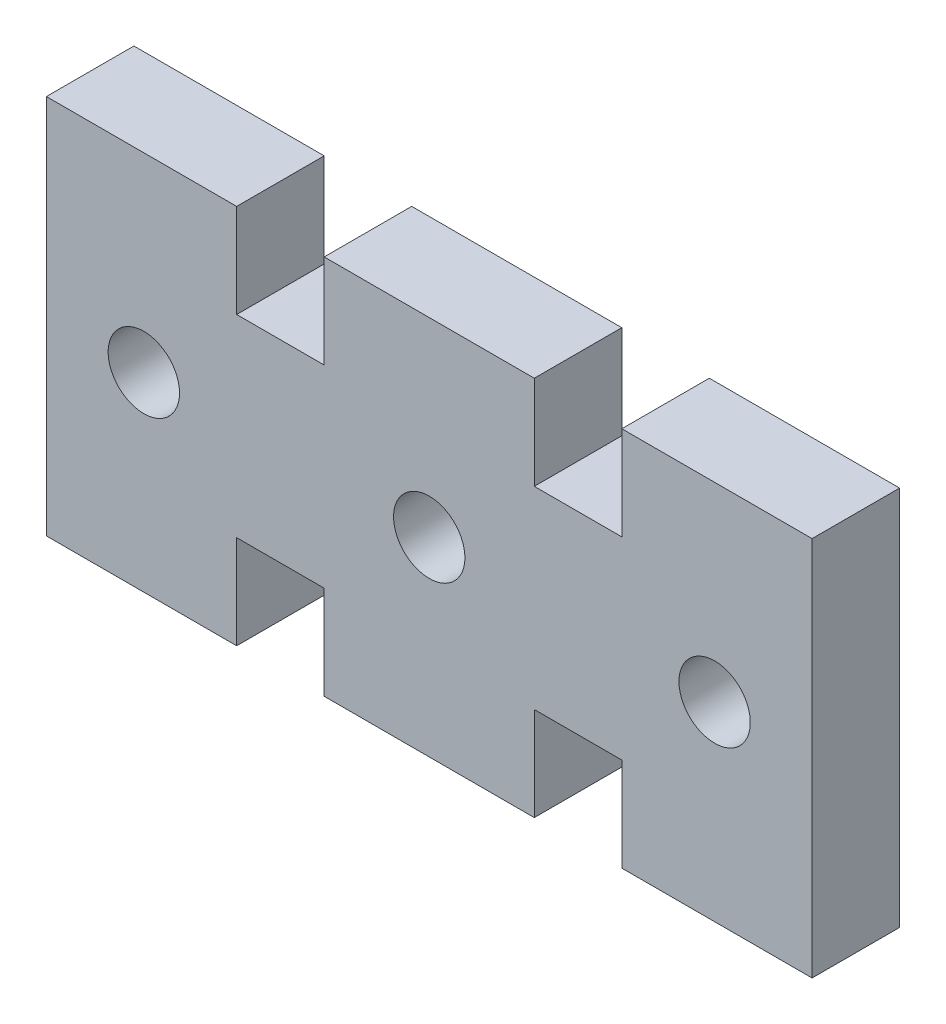
ISO-10303-21;
HEADER;
FILE_DESCRIPTION(('STEP AP214'),'2;1');
FILE_NAME('part.step','',(''),(''),'','','');
FILE_SCHEMA(('AUTOMOTIVE_DESIGN { 1 0 10303 214 1 1 1 1 }'));
ENDSEC;
DATA;
#1=APPLICATION_CONTEXT('core data for automotive mechanical design processes');
#2=APPLICATION_PROTOCOL_DEFINITION('international standard','automotive_design',2000,#1);
#3=PRODUCT_CONTEXT('',#1,'mechanical');
#4=PRODUCT('Part','Part','',(#3));
#5=PRODUCT_RELATED_PRODUCT_CATEGORY('part','',(#4));
#6=PRODUCT_DEFINITION_FORMATION('','',#4);
#7=PRODUCT_DEFINITION_CONTEXT('part definition',#1,'design');
#8=PRODUCT_DEFINITION('design','',#6,#7);
#9=PRODUCT_DEFINITION_SHAPE('','',#8);
#10=(LENGTH_UNIT() NAMED_UNIT(*) SI_UNIT(.MILLI.,.METRE.));
#11=(NAMED_UNIT(*) PLANE_ANGLE_UNIT() SI_UNIT($,.RADIAN.));
#12=(NAMED_UNIT(*) SI_UNIT($,.STERADIAN.) SOLID_ANGLE_UNIT());
#13=UNCERTAINTY_MEASURE_WITH_UNIT(LENGTH_MEASURE(1.E-05),#10,'distance_accuracy_value','');
#14=(GEOMETRIC_REPRESENTATION_CONTEXT(3) GLOBAL_UNCERTAINTY_ASSIGNED_CONTEXT((#13)) GLOBAL_UNIT_ASSIGNED_CONTEXT((#10,
#11,#12)) REPRESENTATION_CONTEXT('',''));
#15=CARTESIAN_POINT('',(0.,0.,0.));
#16=DIRECTION('',(0.,0.,1.));
#17=DIRECTION('',(1.,0.,0.));
#18=AXIS2_PLACEMENT_3D('',#15,#16,#17);
#19=CARTESIAN_POINT('',(0.,0.,5.842));
#20=DIRECTION('',(0.,0.,-1.));
#21=DIRECTION('',(-1.,0.,0.));
#22=AXIS2_PLACEMENT_3D('',#19,#20,#21);
#23=PLANE('',#22);
#24=DIRECTION('',(-1.,0.,0.));
#25=VECTOR('',#24,1.);
#26=CARTESIAN_POINT('',(-12.8540002,12.7,5.842));
#27=LINE('',#26,#25);
#28=CARTESIAN_POINT('',(-12.8540002,12.7,5.842));
#29=VERTEX_POINT('',#28);
#30=CARTESIAN_POINT('',(-25.5540002,12.7,5.842));
#31=VERTEX_POINT('',#30);
#32=EDGE_CURVE('E243',#29,#31,#27,.T.);
#33=ORIENTED_EDGE('',*,*,#32,.T.);
#34=DIRECTION('',(0.,-1.,0.));
#35=VECTOR('',#34,1.);
#36=CARTESIAN_POINT('',(-25.5540002,-12.7,5.842));
#37=LINE('',#36,#35);
#38=CARTESIAN_POINT('',(-25.5540002,-12.7,5.842));
#39=VERTEX_POINT('',#38);
#40=EDGE_CURVE('E131',#31,#39,#37,.T.);
#41=ORIENTED_EDGE('',*,*,#40,.T.);
#42=DIRECTION('',(1.,0.,0.));
#43=VECTOR('',#42,1.);
#44=CARTESIAN_POINT('',(-12.8540002,-12.7,5.842));
#45=LINE('',#44,#43);
#46=CARTESIAN_POINT('',(-12.8540002,-12.7,5.842));
#47=VERTEX_POINT('',#46);
#48=EDGE_CURVE('E294',#39,#47,#45,.T.);
#49=ORIENTED_EDGE('',*,*,#48,.T.);
#50=DIRECTION('',(0.,1.,0.));
#51=VECTOR('',#50,1.);
#52=CARTESIAN_POINT('',(-12.8540002,-6.45000000000002,5.842));
#53=LINE('',#52,#51);
#54=CARTESIAN_POINT('',(-12.8540002,-6.45000000000002,5.842));
#55=VERTEX_POINT('',#54);
#56=EDGE_CURVE('E313',#47,#55,#53,.T.);
#57=ORIENTED_EDGE('',*,*,#56,.T.);
#58=DIRECTION('',(1.,0.,0.));
#59=VECTOR('',#58,1.);
#60=CARTESIAN_POINT('',(-7.0120002,-6.45000000000002,5.842));
#61=LINE('',#60,#59);
#62=CARTESIAN_POINT('',(-7.0120002,-6.45000000000002,5.842));
#63=VERTEX_POINT('',#62);
#64=EDGE_CURVE('E310',#55,#63,#61,.T.);
#65=ORIENTED_EDGE('',*,*,#64,.T.);
#66=DIRECTION('',(0.,-1.,0.));
#67=VECTOR('',#66,1.);
#68=CARTESIAN_POINT('',(-7.0120002,-6.45000000000002,5.842));
#69=LINE('',#68,#67);
#70=CARTESIAN_POINT('',(-7.0120002,-12.7,5.842));
#71=VERTEX_POINT('',#70);
#72=EDGE_CURVE('E312',#63,#71,#69,.T.);
#73=ORIENTED_EDGE('',*,*,#72,.T.);
#74=DIRECTION('',(1.,0.,0.));
#75=VECTOR('',#74,1.);
#76=CARTESIAN_POINT('',(7.01200019999999,-12.7,5.842));
#77=LINE('',#76,#75);
#78=CARTESIAN_POINT('',(7.01200019999999,-12.7,5.842));
#79=VERTEX_POINT('',#78);
#80=EDGE_CURVE('E315',#71,#79,#77,.T.);
#81=ORIENTED_EDGE('',*,*,#80,.T.);
#82=DIRECTION('',(0.,1.,0.));
#83=VECTOR('',#82,1.);
#84=CARTESIAN_POINT('',(7.0120002,-6.45000000000002,5.842));
#85=LINE('',#84,#83);
#86=CARTESIAN_POINT('',(7.0120002,-6.45000000000002,5.842));
#87=VERTEX_POINT('',#86);
#88=EDGE_CURVE('E321',#79,#87,#85,.T.);
#89=ORIENTED_EDGE('',*,*,#88,.T.);
#90=DIRECTION('',(1.,0.,0.));
#91=VECTOR('',#90,1.);
#92=CARTESIAN_POINT('',(7.0120002,-6.45000000000002,5.842));
#93=LINE('',#92,#91);
#94=CARTESIAN_POINT('',(12.8540002,-6.45000000000002,5.842));
#95=VERTEX_POINT('',#94);
#96=EDGE_CURVE('E323',#87,#95,#93,.T.);
#97=ORIENTED_EDGE('',*,*,#96,.T.);
#98=DIRECTION('',(0.,-1.,0.));
#99=VECTOR('',#98,1.);
#100=CARTESIAN_POINT('',(12.8540002,-6.45000000000002,5.842));
#101=LINE('',#100,#99);
#102=CARTESIAN_POINT('',(12.8540002,-12.7,5.842));
#103=VERTEX_POINT('',#102);
#104=EDGE_CURVE('E325',#95,#103,#101,.T.);
#105=ORIENTED_EDGE('',*,*,#104,.T.);
#106=DIRECTION('',(1.,0.,0.));
#107=VECTOR('',#106,1.);
#108=CARTESIAN_POINT('',(25.5540002,-12.7,5.842));
#109=LINE('',#108,#107);
#110=CARTESIAN_POINT('',(25.5540002,-12.7,5.842));
#111=VERTEX_POINT('',#110);
#112=EDGE_CURVE('E327',#103,#111,#109,.T.);
#113=ORIENTED_EDGE('',*,*,#112,.T.);
#114=DIRECTION('',(0.,1.,0.));
#115=VECTOR('',#114,1.);
#116=CARTESIAN_POINT('',(25.5540002,-12.7,5.842));
#117=LINE('',#116,#115);
#118=CARTESIAN_POINT('',(25.5540002,12.7,5.842));
#119=VERTEX_POINT('',#118);
#120=EDGE_CURVE('E329',#111,#119,#117,.T.);
#121=ORIENTED_EDGE('',*,*,#120,.T.);
#122=DIRECTION('',(-1.,0.,0.));
#123=VECTOR('',#122,1.);
#124=CARTESIAN_POINT('',(25.5540002,12.7,5.842));
#125=LINE('',#124,#123);
#126=CARTESIAN_POINT('',(12.8540002,12.7,5.842));
#127=VERTEX_POINT('',#126);
#128=EDGE_CURVE('E331',#119,#127,#125,.T.);
#129=ORIENTED_EDGE('',*,*,#128,.T.);
#130=DIRECTION('',(0.,-1.,0.));
#131=VECTOR('',#130,1.);
#132=CARTESIAN_POINT('',(12.8540002,6.45000000000001,5.842));
#133=LINE('',#132,#131);
#134=CARTESIAN_POINT('',(12.8540002,6.45000000000001,5.842));
#135=VERTEX_POINT('',#134);
#136=EDGE_CURVE('E333',#127,#135,#133,.T.);
#137=ORIENTED_EDGE('',*,*,#136,.T.);
#138=DIRECTION('',(-1.,0.,0.));
#139=VECTOR('',#138,1.);
#140=CARTESIAN_POINT('',(7.0120002,6.45000000000001,5.842));
#141=LINE('',#140,#139);
#142=CARTESIAN_POINT('',(7.0120002,6.45000000000001,5.842));
#143=VERTEX_POINT('',#142);
#144=EDGE_CURVE('E335',#135,#143,#141,.T.);
#145=ORIENTED_EDGE('',*,*,#144,.T.);
#146=DIRECTION('',(0.,1.,0.));
#147=VECTOR('',#146,1.);
#148=CARTESIAN_POINT('',(7.0120002,6.45000000000001,5.842));
#149=LINE('',#148,#147);
#150=CARTESIAN_POINT('',(7.01200019999999,12.7,5.842));
#151=VERTEX_POINT('',#150);
#152=EDGE_CURVE('E337',#143,#151,#149,.T.);
#153=ORIENTED_EDGE('',*,*,#152,.T.);
#154=DIRECTION('',(-1.,0.,0.));
#155=VECTOR('',#154,1.);
#156=CARTESIAN_POINT('',(7.01200019999999,12.7,5.842));
#157=LINE('',#156,#155);
#158=CARTESIAN_POINT('',(-7.0120002,12.7,5.842));
#159=VERTEX_POINT('',#158);
#160=EDGE_CURVE('E186',#151,#159,#157,.T.);
#161=ORIENTED_EDGE('',*,*,#160,.T.);
#162=DIRECTION('',(0.,-1.,0.));
#163=VECTOR('',#162,1.);
#164=CARTESIAN_POINT('',(-7.0120002,6.45000000000001,5.842));
#165=LINE('',#164,#163);
#166=CARTESIAN_POINT('',(-7.0120002,6.45000000000001,5.842));
#167=VERTEX_POINT('',#166);
#168=EDGE_CURVE('E180',#159,#167,#165,.T.);
#169=ORIENTED_EDGE('',*,*,#168,.T.);
#170=DIRECTION('',(-1.,0.,0.));
#171=VECTOR('',#170,1.);
#172=CARTESIAN_POINT('',(-7.0120002,6.45000000000001,5.842));
#173=LINE('',#172,#171);
#174=CARTESIAN_POINT('',(-12.8540002,6.45000000000001,5.842));
#175=VERTEX_POINT('',#174);
#176=EDGE_CURVE('E184',#167,#175,#173,.T.);
#177=ORIENTED_EDGE('',*,*,#176,.T.);
#178=DIRECTION('',(0.,1.,0.));
#179=VECTOR('',#178,1.);
#180=CARTESIAN_POINT('',(-12.8540002,6.45000000000001,5.842));
#181=LINE('',#180,#179);
#182=EDGE_CURVE('E52',#175,#29,#181,.T.);
#183=ORIENTED_EDGE('',*,*,#182,.T.);
#184=EDGE_LOOP('',(#33,#41,#49,#57,#65,#73,#81,#89,#97,#105,#113,#121,#129,#137,#145,#153,#161,
#169,#177,#183));
#185=FACE_BOUND('',#184,.T.);
#186=CARTESIAN_POINT('',(0.,0.,5.842));
#187=DIRECTION('',(0.,0.,1.));
#188=DIRECTION('',(1.,0.,0.));
#189=AXIS2_PLACEMENT_3D('',#186,#187,#188);
#190=CIRCLE('',#189,2.38125);
#191=CARTESIAN_POINT('',(2.38125,0.,5.842));
#192=VERTEX_POINT('',#191);
#193=EDGE_CURVE('E208',#192,#192,#190,.T.);
#194=ORIENTED_EDGE('',*,*,#193,.F.);
#195=EDGE_LOOP('',(#194));
#196=FACE_BOUND('',#195,.T.);
#197=CARTESIAN_POINT('',(-19.05,-1.2955599205797E-13,5.842));
#198=DIRECTION('',(0.,0.,1.));
#199=DIRECTION('',(1.,0.,0.));
#200=AXIS2_PLACEMENT_3D('',#197,#198,#199);
#201=CIRCLE('',#200,2.38125);
#202=CARTESIAN_POINT('',(-16.66875,-1.2955599205797E-13,5.842));
#203=VERTEX_POINT('',#202);
#204=EDGE_CURVE('E391',#203,#203,#201,.T.);
#205=ORIENTED_EDGE('',*,*,#204,.F.);
#206=EDGE_LOOP('',(#205));
#207=FACE_BOUND('',#206,.T.);
#208=CARTESIAN_POINT('',(19.05,-1.2955599205797E-13,5.842));
#209=DIRECTION('',(0.,0.,1.));
#210=DIRECTION('',(-1.,0.,0.));
#211=AXIS2_PLACEMENT_3D('',#208,#209,#210);
#212=CIRCLE('',#211,2.38125);
#213=CARTESIAN_POINT('',(16.66875,-1.2955599205797E-13,5.842));
#214=VERTEX_POINT('',#213);
#215=EDGE_CURVE('E382',#214,#214,#212,.T.);
#216=ORIENTED_EDGE('',*,*,#215,.F.);
#217=EDGE_LOOP('',(#216));
#218=FACE_BOUND('',#217,.T.);
#219=ADVANCED_FACE('F35',(#185,#196,#207,#218),#23,.F.);
#220=CARTESIAN_POINT('',(0.,0.,0.));
#221=DIRECTION('',(0.,0.,-1.));
#222=DIRECTION('',(-1.,0.,0.));
#223=AXIS2_PLACEMENT_3D('',#220,#221,#222);
#224=PLANE('',#223);
#225=CARTESIAN_POINT('',(-19.05,-1.2955599205797E-13,0.));
#226=DIRECTION('',(0.,0.,1.));
#227=DIRECTION('',(1.,0.,0.));
#228=AXIS2_PLACEMENT_3D('',#225,#226,#227);
#229=CIRCLE('',#228,2.38125);
#230=CARTESIAN_POINT('',(-16.66875,-1.2955599205797E-13,0.));
#231=VERTEX_POINT('',#230);
#232=EDGE_CURVE('E388',#231,#231,#229,.T.);
#233=ORIENTED_EDGE('',*,*,#232,.T.);
#234=EDGE_LOOP('',(#233));
#235=FACE_BOUND('',#234,.T.);
#236=DIRECTION('',(-1.,0.,0.));
#237=VECTOR('',#236,1.);
#238=CARTESIAN_POINT('',(-12.8540002,12.7,0.));
#239=LINE('',#238,#237);
#240=CARTESIAN_POINT('',(-12.8540002,12.7,0.));
#241=VERTEX_POINT('',#240);
#242=CARTESIAN_POINT('',(-25.5540002,12.7,0.));
#243=VERTEX_POINT('',#242);
#244=EDGE_CURVE('E204',#241,#243,#239,.T.);
#245=ORIENTED_EDGE('',*,*,#244,.F.);
#246=DIRECTION('',(0.,1.,0.));
#247=VECTOR('',#246,1.);
#248=CARTESIAN_POINT('',(-12.8540002,6.45000000000001,0.));
#249=LINE('',#248,#247);
#250=CARTESIAN_POINT('',(-12.8540002,6.45000000000001,0.));
#251=VERTEX_POINT('',#250);
#252=EDGE_CURVE('E123',#251,#241,#249,.T.);
#253=ORIENTED_EDGE('',*,*,#252,.F.);
#254=DIRECTION('',(-1.,0.,0.));
#255=VECTOR('',#254,1.);
#256=CARTESIAN_POINT('',(-7.0120002,6.45000000000001,0.));
#257=LINE('',#256,#255);
#258=CARTESIAN_POINT('',(-7.0120002,6.45000000000001,0.));
#259=VERTEX_POINT('',#258);
#260=EDGE_CURVE('E117',#259,#251,#257,.T.);
#261=ORIENTED_EDGE('',*,*,#260,.F.);
#262=DIRECTION('',(0.,-1.,0.));
#263=VECTOR('',#262,1.);
#264=CARTESIAN_POINT('',(-7.0120002,6.45000000000001,0.));
#265=LINE('',#264,#263);
#266=CARTESIAN_POINT('',(-7.0120002,12.7,0.));
#267=VERTEX_POINT('',#266);
#268=EDGE_CURVE('E194',#267,#259,#265,.T.);
#269=ORIENTED_EDGE('',*,*,#268,.F.);
#270=DIRECTION('',(-1.,0.,0.));
#271=VECTOR('',#270,1.);
#272=CARTESIAN_POINT('',(7.01200019999999,12.7,0.));
#273=LINE('',#272,#271);
#274=CARTESIAN_POINT('',(7.01200019999999,12.7,0.));
#275=VERTEX_POINT('',#274);
#276=EDGE_CURVE('E238',#275,#267,#273,.T.);
#277=ORIENTED_EDGE('',*,*,#276,.F.);
#278=DIRECTION('',(0.,1.,0.));
#279=VECTOR('',#278,1.);
#280=CARTESIAN_POINT('',(7.0120002,6.45000000000001,0.));
#281=LINE('',#280,#279);
#282=CARTESIAN_POINT('',(7.0120002,6.45000000000001,0.));
#283=VERTEX_POINT('',#282);
#284=EDGE_CURVE('E236',#283,#275,#281,.T.);
#285=ORIENTED_EDGE('',*,*,#284,.F.);
#286=DIRECTION('',(-1.,0.,0.));
#287=VECTOR('',#286,1.);
#288=CARTESIAN_POINT('',(7.0120002,6.45000000000001,0.));
#289=LINE('',#288,#287);
#290=CARTESIAN_POINT('',(12.8540002,6.45000000000001,0.));
#291=VERTEX_POINT('',#290);
#292=EDGE_CURVE('E234',#291,#283,#289,.T.);
#293=ORIENTED_EDGE('',*,*,#292,.F.);
#294=DIRECTION('',(0.,-1.,0.));
#295=VECTOR('',#294,1.);
#296=CARTESIAN_POINT('',(12.8540002,6.45000000000001,0.));
#297=LINE('',#296,#295);
#298=CARTESIAN_POINT('',(12.8540002,12.7,0.));
#299=VERTEX_POINT('',#298);
#300=EDGE_CURVE('E232',#299,#291,#297,.T.);
#301=ORIENTED_EDGE('',*,*,#300,.F.);
#302=DIRECTION('',(-1.,0.,0.));
#303=VECTOR('',#302,1.);
#304=CARTESIAN_POINT('',(25.5540002,12.7,0.));
#305=LINE('',#304,#303);
#306=CARTESIAN_POINT('',(25.5540002,12.7,0.));
#307=VERTEX_POINT('',#306);
#308=EDGE_CURVE('E230',#307,#299,#305,.T.);
#309=ORIENTED_EDGE('',*,*,#308,.F.);
#310=DIRECTION('',(0.,1.,0.));
#311=VECTOR('',#310,1.);
#312=CARTESIAN_POINT('',(25.5540002,-12.7,0.));
#313=LINE('',#312,#311);
#314=CARTESIAN_POINT('',(25.5540002,-12.7,0.));
#315=VERTEX_POINT('',#314);
#316=EDGE_CURVE('E228',#315,#307,#313,.T.);
#317=ORIENTED_EDGE('',*,*,#316,.F.);
#318=DIRECTION('',(1.,0.,0.));
#319=VECTOR('',#318,1.);
#320=CARTESIAN_POINT('',(25.5540002,-12.7,0.));
#321=LINE('',#320,#319);
#322=CARTESIAN_POINT('',(12.8540002,-12.7,0.));
#323=VERTEX_POINT('',#322);
#324=EDGE_CURVE('E226',#323,#315,#321,.T.);
#325=ORIENTED_EDGE('',*,*,#324,.F.);
#326=DIRECTION('',(0.,-1.,0.));
#327=VECTOR('',#326,1.);
#328=CARTESIAN_POINT('',(12.8540002,-6.45000000000002,0.));
#329=LINE('',#328,#327);
#330=CARTESIAN_POINT('',(12.8540002,-6.45000000000002,0.));
#331=VERTEX_POINT('',#330);
#332=EDGE_CURVE('E224',#331,#323,#329,.T.);
#333=ORIENTED_EDGE('',*,*,#332,.F.);
#334=DIRECTION('',(1.,0.,0.));
#335=VECTOR('',#334,1.);
#336=CARTESIAN_POINT('',(7.0120002,-6.45000000000002,0.));
#337=LINE('',#336,#335);
#338=CARTESIAN_POINT('',(7.0120002,-6.45000000000002,0.));
#339=VERTEX_POINT('',#338);
#340=EDGE_CURVE('E222',#339,#331,#337,.T.);
#341=ORIENTED_EDGE('',*,*,#340,.F.);
#342=DIRECTION('',(0.,1.,0.));
#343=VECTOR('',#342,1.);
#344=CARTESIAN_POINT('',(7.0120002,-6.45000000000002,0.));
#345=LINE('',#344,#343);
#346=CARTESIAN_POINT('',(7.01200019999999,-12.7,0.));
#347=VERTEX_POINT('',#346);
#348=EDGE_CURVE('E220',#347,#339,#345,.T.);
#349=ORIENTED_EDGE('',*,*,#348,.F.);
#350=DIRECTION('',(1.,0.,0.));
#351=VECTOR('',#350,1.);
#352=CARTESIAN_POINT('',(7.01200019999999,-12.7,0.));
#353=LINE('',#352,#351);
#354=CARTESIAN_POINT('',(-7.0120002,-12.7,0.));
#355=VERTEX_POINT('',#354);
#356=EDGE_CURVE('E218',#355,#347,#353,.T.);
#357=ORIENTED_EDGE('',*,*,#356,.F.);
#358=DIRECTION('',(0.,-1.,0.));
#359=VECTOR('',#358,1.);
#360=CARTESIAN_POINT('',(-7.0120002,-6.45000000000002,0.));
#361=LINE('',#360,#359);
#362=CARTESIAN_POINT('',(-7.0120002,-6.45000000000002,0.));
#363=VERTEX_POINT('',#362);
#364=EDGE_CURVE('E216',#363,#355,#361,.T.);
#365=ORIENTED_EDGE('',*,*,#364,.F.);
#366=DIRECTION('',(1.,0.,0.));
#367=VECTOR('',#366,1.);
#368=CARTESIAN_POINT('',(-7.0120002,-6.45000000000002,0.));
#369=LINE('',#368,#367);
#370=CARTESIAN_POINT('',(-12.8540002,-6.45000000000002,0.));
#371=VERTEX_POINT('',#370);
#372=EDGE_CURVE('E214',#371,#363,#369,.T.);
#373=ORIENTED_EDGE('',*,*,#372,.F.);
#374=DIRECTION('',(0.,1.,0.));
#375=VECTOR('',#374,1.);
#376=CARTESIAN_POINT('',(-12.8540002,-6.45000000000002,0.));
#377=LINE('',#376,#375);
#378=CARTESIAN_POINT('',(-12.8540002,-12.7,0.));
#379=VERTEX_POINT('',#378);
#380=EDGE_CURVE('E212',#379,#371,#377,.T.);
#381=ORIENTED_EDGE('',*,*,#380,.F.);
#382=DIRECTION('',(1.,0.,0.));
#383=VECTOR('',#382,1.);
#384=CARTESIAN_POINT('',(-12.8540002,-12.7,0.));
#385=LINE('',#384,#383);
#386=CARTESIAN_POINT('',(-25.5540002,-12.7,0.));
#387=VERTEX_POINT('',#386);
#388=EDGE_CURVE('E210',#387,#379,#385,.T.);
#389=ORIENTED_EDGE('',*,*,#388,.F.);
#390=DIRECTION('',(0.,-1.,0.));
#391=VECTOR('',#390,1.);
#392=CARTESIAN_POINT('',(-25.5540002,-12.7,0.));
#393=LINE('',#392,#391);
#394=EDGE_CURVE('E207',#243,#387,#393,.T.);
#395=ORIENTED_EDGE('',*,*,#394,.F.);
#396=EDGE_LOOP('',(#245,#253,#261,#269,#277,#285,#293,#301,#309,#317,#325,#333,#341,#349,#357,
#365,#373,#381,#389,#395));
#397=FACE_BOUND('',#396,.T.);
#398=CARTESIAN_POINT('',(0.,0.,0.));
#399=DIRECTION('',(0.,0.,1.));
#400=DIRECTION('',(1.,0.,0.));
#401=AXIS2_PLACEMENT_3D('',#398,#399,#400);
#402=CIRCLE('',#401,2.38125);
#403=CARTESIAN_POINT('',(2.38125,0.,0.));
#404=VERTEX_POINT('',#403);
#405=EDGE_CURVE('E394',#404,#404,#402,.T.);
#406=ORIENTED_EDGE('',*,*,#405,.T.);
#407=EDGE_LOOP('',(#406));
#408=FACE_BOUND('',#407,.T.);
#409=CARTESIAN_POINT('',(19.05,-1.2955599205797E-13,0.));
#410=DIRECTION('',(0.,0.,1.));
#411=DIRECTION('',(-1.,0.,0.));
#412=AXIS2_PLACEMENT_3D('',#409,#410,#411);
#413=CIRCLE('',#412,2.38125);
#414=CARTESIAN_POINT('',(16.66875,-1.2955599205797E-13,0.));
#415=VERTEX_POINT('',#414);
#416=EDGE_CURVE('E385',#415,#415,#413,.T.);
#417=ORIENTED_EDGE('',*,*,#416,.T.);
#418=EDGE_LOOP('',(#417));
#419=FACE_BOUND('',#418,.T.);
#420=ADVANCED_FACE('F298',(#235,#397,#408,#419),#224,.T.);
#421=CARTESIAN_POINT('',(-12.8540002,12.7,5.842));
#422=DIRECTION('',(0.,-1.,0.));
#423=DIRECTION('',(1.,0.,0.));
#424=AXIS2_PLACEMENT_3D('',#421,#422,#423);
#425=PLANE('',#424);
#426=ORIENTED_EDGE('',*,*,#244,.T.);
#427=DIRECTION('',(0.,0.,-1.));
#428=VECTOR('',#427,1.);
#429=CARTESIAN_POINT('',(-25.5540002,12.7,5.842));
#430=LINE('',#429,#428);
#431=EDGE_CURVE('E11',#31,#243,#430,.T.);
#432=ORIENTED_EDGE('',*,*,#431,.F.);
#433=ORIENTED_EDGE('',*,*,#32,.F.);
#434=DIRECTION('',(0.,0.,-1.));
#435=VECTOR('',#434,1.);
#436=CARTESIAN_POINT('',(-12.8540002,12.7,5.842));
#437=LINE('',#436,#435);
#438=EDGE_CURVE('E200',#29,#241,#437,.T.);
#439=ORIENTED_EDGE('',*,*,#438,.T.);
#440=EDGE_LOOP('',(#426,#432,#433,#439));
#441=FACE_BOUND('',#440,.T.);
#442=ADVANCED_FACE('F37',(#441),#425,.F.);
#443=CARTESIAN_POINT('',(-25.5540002,-12.7,5.842));
#444=DIRECTION('',(1.,0.,0.));
#445=DIRECTION('',(0.,0.,-1.));
#446=AXIS2_PLACEMENT_3D('',#443,#444,#445);
#447=PLANE('',#446);
#448=ORIENTED_EDGE('',*,*,#394,.T.);
#449=DIRECTION('',(0.,0.,-1.));
#450=VECTOR('',#449,1.);
#451=CARTESIAN_POINT('',(-25.5540002,-12.7,5.842));
#452=LINE('',#451,#450);
#453=EDGE_CURVE('E44',#39,#387,#452,.T.);
#454=ORIENTED_EDGE('',*,*,#453,.F.);
#455=ORIENTED_EDGE('',*,*,#40,.F.);
#456=ORIENTED_EDGE('',*,*,#431,.T.);
#457=EDGE_LOOP('',(#448,#454,#455,#456));
#458=FACE_BOUND('',#457,.T.);
#459=ADVANCED_FACE('F577',(#458),#447,.F.);
#460=CARTESIAN_POINT('',(-12.8540002,-12.7,5.842));
#461=DIRECTION('',(0.,1.,0.));
#462=DIRECTION('',(-1.,0.,0.));
#463=AXIS2_PLACEMENT_3D('',#460,#461,#462);
#464=PLANE('',#463);
#465=ORIENTED_EDGE('',*,*,#388,.T.);
#466=DIRECTION('',(0.,0.,-1.));
#467=VECTOR('',#466,1.);
#468=CARTESIAN_POINT('',(-12.8540002,-12.7,5.842));
#469=LINE('',#468,#467);
#470=EDGE_CURVE('E286',#47,#379,#469,.T.);
#471=ORIENTED_EDGE('',*,*,#470,.F.);
#472=ORIENTED_EDGE('',*,*,#48,.F.);
#473=ORIENTED_EDGE('',*,*,#453,.T.);
#474=EDGE_LOOP('',(#465,#471,#472,#473));
#475=FACE_BOUND('',#474,.T.);
#476=ADVANCED_FACE('F292',(#475),#464,.F.);
#477=CARTESIAN_POINT('',(-12.8540002,-6.45000000000002,5.842));
#478=DIRECTION('',(-1.,0.,0.));
#479=DIRECTION('',(0.,-1.,0.));
#480=AXIS2_PLACEMENT_3D('',#477,#478,#479);
#481=PLANE('',#480);
#482=ORIENTED_EDGE('',*,*,#380,.T.);
#483=DIRECTION('',(0.,0.,-1.));
#484=VECTOR('',#483,1.);
#485=CARTESIAN_POINT('',(-12.8540002,-6.45000000000002,5.842));
#486=LINE('',#485,#484);
#487=EDGE_CURVE('E283',#55,#371,#486,.T.);
#488=ORIENTED_EDGE('',*,*,#487,.F.);
#489=ORIENTED_EDGE('',*,*,#56,.F.);
#490=ORIENTED_EDGE('',*,*,#470,.T.);
#491=EDGE_LOOP('',(#482,#488,#489,#490));
#492=FACE_BOUND('',#491,.T.);
#493=ADVANCED_FACE('F304',(#492),#481,.F.);
#494=CARTESIAN_POINT('',(-7.0120002,-6.45000000000002,5.842));
#495=DIRECTION('',(0.,1.,0.));
#496=DIRECTION('',(-1.,0.,0.));
#497=AXIS2_PLACEMENT_3D('',#494,#495,#496);
#498=PLANE('',#497);
#499=ORIENTED_EDGE('',*,*,#372,.T.);
#500=DIRECTION('',(0.,0.,-1.));
#501=VECTOR('',#500,1.);
#502=CARTESIAN_POINT('',(-7.0120002,-6.45000000000002,5.842));
#503=LINE('',#502,#501);
#504=EDGE_CURVE('E280',#63,#363,#503,.T.);
#505=ORIENTED_EDGE('',*,*,#504,.F.);
#506=ORIENTED_EDGE('',*,*,#64,.F.);
#507=ORIENTED_EDGE('',*,*,#487,.T.);
#508=EDGE_LOOP('',(#499,#505,#506,#507));
#509=FACE_BOUND('',#508,.T.);
#510=ADVANCED_FACE('F308',(#509),#498,.F.);
#511=CARTESIAN_POINT('',(-7.0120002,-6.45000000000002,5.842));
#512=DIRECTION('',(1.,0.,0.));
#513=DIRECTION('',(0.,1.,0.));
#514=AXIS2_PLACEMENT_3D('',#511,#512,#513);
#515=PLANE('',#514);
#516=ORIENTED_EDGE('',*,*,#364,.T.);
#517=DIRECTION('',(0.,0.,-1.));
#518=VECTOR('',#517,1.);
#519=CARTESIAN_POINT('',(-7.0120002,-12.7,5.842));
#520=LINE('',#519,#518);
#521=EDGE_CURVE('E277',#71,#355,#520,.T.);
#522=ORIENTED_EDGE('',*,*,#521,.F.);
#523=ORIENTED_EDGE('',*,*,#72,.F.);
#524=ORIENTED_EDGE('',*,*,#504,.T.);
#525=EDGE_LOOP('',(#516,#522,#523,#524));
#526=FACE_BOUND('',#525,.T.);
#527=ADVANCED_FACE('F542',(#526),#515,.F.);
#528=CARTESIAN_POINT('',(7.01200019999999,-12.7,5.842));
#529=DIRECTION('',(0.,1.,0.));
#530=DIRECTION('',(0.,0.,1.));
#531=AXIS2_PLACEMENT_3D('',#528,#529,#530);
#532=PLANE('',#531);
#533=ORIENTED_EDGE('',*,*,#356,.T.);
#534=DIRECTION('',(0.,0.,-1.));
#535=VECTOR('',#534,1.);
#536=CARTESIAN_POINT('',(7.01200019999999,-12.7,5.842));
#537=LINE('',#536,#535);
#538=EDGE_CURVE('E274',#79,#347,#537,.T.);
#539=ORIENTED_EDGE('',*,*,#538,.F.);
#540=ORIENTED_EDGE('',*,*,#80,.F.);
#541=ORIENTED_EDGE('',*,*,#521,.T.);
#542=EDGE_LOOP('',(#533,#539,#540,#541));
#543=FACE_BOUND('',#542,.T.);
#544=ADVANCED_FACE('F532',(#543),#532,.F.);
#545=CARTESIAN_POINT('',(7.0120002,-6.45000000000002,5.842));
#546=DIRECTION('',(-1.,0.,0.));
#547=DIRECTION('',(0.,-1.,0.));
#548=AXIS2_PLACEMENT_3D('',#545,#546,#547);
#549=PLANE('',#548);
#550=ORIENTED_EDGE('',*,*,#348,.T.);
#551=DIRECTION('',(0.,0.,-1.));
#552=VECTOR('',#551,1.);
#553=CARTESIAN_POINT('',(7.0120002,-6.45000000000002,5.842));
#554=LINE('',#553,#552);
#555=EDGE_CURVE('E271',#87,#339,#554,.T.);
#556=ORIENTED_EDGE('',*,*,#555,.F.);
#557=ORIENTED_EDGE('',*,*,#88,.F.);
#558=ORIENTED_EDGE('',*,*,#538,.T.);
#559=EDGE_LOOP('',(#550,#556,#557,#558));
#560=FACE_BOUND('',#559,.T.);
#561=ADVANCED_FACE('F522',(#560),#549,.F.);
#562=CARTESIAN_POINT('',(7.0120002,-6.45000000000002,5.842));
#563=DIRECTION('',(0.,1.,0.));
#564=DIRECTION('',(-1.,0.,0.));
#565=AXIS2_PLACEMENT_3D('',#562,#563,#564);
#566=PLANE('',#565);
#567=ORIENTED_EDGE('',*,*,#340,.T.);
#568=DIRECTION('',(0.,0.,-1.));
#569=VECTOR('',#568,1.);
#570=CARTESIAN_POINT('',(12.8540002,-6.45000000000002,5.842));
#571=LINE('',#570,#569);
#572=EDGE_CURVE('E268',#95,#331,#571,.T.);
#573=ORIENTED_EDGE('',*,*,#572,.F.);
#574=ORIENTED_EDGE('',*,*,#96,.F.);
#575=ORIENTED_EDGE('',*,*,#555,.T.);
#576=EDGE_LOOP('',(#567,#573,#574,#575));
#577=FACE_BOUND('',#576,.T.);
#578=ADVANCED_FACE('F512',(#577),#566,.F.);
#579=CARTESIAN_POINT('',(12.8540002,-6.45000000000002,5.842));
#580=DIRECTION('',(1.,0.,0.));
#581=DIRECTION('',(0.,1.,0.));
#582=AXIS2_PLACEMENT_3D('',#579,#580,#581);
#583=PLANE('',#582);
#584=ORIENTED_EDGE('',*,*,#332,.T.);
#585=DIRECTION('',(0.,0.,-1.));
#586=VECTOR('',#585,1.);
#587=CARTESIAN_POINT('',(12.8540002,-12.7,5.842));
#588=LINE('',#587,#586);
#589=EDGE_CURVE('E265',#103,#323,#588,.T.);
#590=ORIENTED_EDGE('',*,*,#589,.F.);
#591=ORIENTED_EDGE('',*,*,#104,.F.);
#592=ORIENTED_EDGE('',*,*,#572,.T.);
#593=EDGE_LOOP('',(#584,#590,#591,#592));
#594=FACE_BOUND('',#593,.T.);
#595=ADVANCED_FACE('F502',(#594),#583,.F.);
#596=CARTESIAN_POINT('',(25.5540002,-12.7,5.842));
#597=DIRECTION('',(0.,1.,0.));
#598=DIRECTION('',(-1.,0.,0.));
#599=AXIS2_PLACEMENT_3D('',#596,#597,#598);
#600=PLANE('',#599);
#601=ORIENTED_EDGE('',*,*,#324,.T.);
#602=DIRECTION('',(0.,0.,-1.));
#603=VECTOR('',#602,1.);
#604=CARTESIAN_POINT('',(25.5540002,-12.7,5.842));
#605=LINE('',#604,#603);
#606=EDGE_CURVE('E262',#111,#315,#605,.T.);
#607=ORIENTED_EDGE('',*,*,#606,.F.);
#608=ORIENTED_EDGE('',*,*,#112,.F.);
#609=ORIENTED_EDGE('',*,*,#589,.T.);
#610=EDGE_LOOP('',(#601,#607,#608,#609));
#611=FACE_BOUND('',#610,.T.);
#612=ADVANCED_FACE('F492',(#611),#600,.F.);
#613=CARTESIAN_POINT('',(25.5540002,-12.7,5.842));
#614=DIRECTION('',(-1.,0.,0.));
#615=DIRECTION('',(0.,0.,1.));
#616=AXIS2_PLACEMENT_3D('',#613,#614,#615);
#617=PLANE('',#616);
#618=ORIENTED_EDGE('',*,*,#316,.T.);
#619=DIRECTION('',(0.,0.,-1.));
#620=VECTOR('',#619,1.);
#621=CARTESIAN_POINT('',(25.5540002,12.7,5.842));
#622=LINE('',#621,#620);
#623=EDGE_CURVE('E259',#119,#307,#622,.T.);
#624=ORIENTED_EDGE('',*,*,#623,.F.);
#625=ORIENTED_EDGE('',*,*,#120,.F.);
#626=ORIENTED_EDGE('',*,*,#606,.T.);
#627=EDGE_LOOP('',(#618,#624,#625,#626));
#628=FACE_BOUND('',#627,.T.);
#629=ADVANCED_FACE('F482',(#628),#617,.F.);
#630=CARTESIAN_POINT('',(25.5540002,12.7,5.842));
#631=DIRECTION('',(0.,-1.,0.));
#632=DIRECTION('',(1.,0.,0.));
#633=AXIS2_PLACEMENT_3D('',#630,#631,#632);
#634=PLANE('',#633);
#635=ORIENTED_EDGE('',*,*,#308,.T.);
#636=DIRECTION('',(0.,0.,-1.));
#637=VECTOR('',#636,1.);
#638=CARTESIAN_POINT('',(12.8540002,12.7,5.842));
#639=LINE('',#638,#637);
#640=EDGE_CURVE('E256',#127,#299,#639,.T.);
#641=ORIENTED_EDGE('',*,*,#640,.F.);
#642=ORIENTED_EDGE('',*,*,#128,.F.);
#643=ORIENTED_EDGE('',*,*,#623,.T.);
#644=EDGE_LOOP('',(#635,#641,#642,#643));
#645=FACE_BOUND('',#644,.T.);
#646=ADVANCED_FACE('F472',(#645),#634,.F.);
#647=CARTESIAN_POINT('',(12.8540002,6.45000000000001,5.842));
#648=DIRECTION('',(1.,0.,0.));
#649=DIRECTION('',(0.,1.,0.));
#650=AXIS2_PLACEMENT_3D('',#647,#648,#649);
#651=PLANE('',#650);
#652=ORIENTED_EDGE('',*,*,#300,.T.);
#653=DIRECTION('',(0.,0.,-1.));
#654=VECTOR('',#653,1.);
#655=CARTESIAN_POINT('',(12.8540002,6.45000000000001,5.842));
#656=LINE('',#655,#654);
#657=EDGE_CURVE('E253',#135,#291,#656,.T.);
#658=ORIENTED_EDGE('',*,*,#657,.F.);
#659=ORIENTED_EDGE('',*,*,#136,.F.);
#660=ORIENTED_EDGE('',*,*,#640,.T.);
#661=EDGE_LOOP('',(#652,#658,#659,#660));
#662=FACE_BOUND('',#661,.T.);
#663=ADVANCED_FACE('F462',(#662),#651,.F.);
#664=CARTESIAN_POINT('',(7.0120002,6.45000000000001,5.842));
#665=DIRECTION('',(0.,-1.,0.));
#666=DIRECTION('',(1.,0.,0.));
#667=AXIS2_PLACEMENT_3D('',#664,#665,#666);
#668=PLANE('',#667);
#669=ORIENTED_EDGE('',*,*,#292,.T.);
#670=DIRECTION('',(0.,0.,-1.));
#671=VECTOR('',#670,1.);
#672=CARTESIAN_POINT('',(7.0120002,6.45000000000001,5.842));
#673=LINE('',#672,#671);
#674=EDGE_CURVE('E250',#143,#283,#673,.T.);
#675=ORIENTED_EDGE('',*,*,#674,.F.);
#676=ORIENTED_EDGE('',*,*,#144,.F.);
#677=ORIENTED_EDGE('',*,*,#657,.T.);
#678=EDGE_LOOP('',(#669,#675,#676,#677));
#679=FACE_BOUND('',#678,.T.);
#680=ADVANCED_FACE('F453',(#679),#668,.F.);
#681=CARTESIAN_POINT('',(7.0120002,6.45000000000001,5.842));
#682=DIRECTION('',(-1.,0.,0.));
#683=DIRECTION('',(0.,-1.,0.));
#684=AXIS2_PLACEMENT_3D('',#681,#682,#683);
#685=PLANE('',#684);
#686=ORIENTED_EDGE('',*,*,#284,.T.);
#687=DIRECTION('',(0.,0.,-1.));
#688=VECTOR('',#687,1.);
#689=CARTESIAN_POINT('',(7.01200019999999,12.7,5.842));
#690=LINE('',#689,#688);
#691=EDGE_CURVE('E247',#151,#275,#690,.T.);
#692=ORIENTED_EDGE('',*,*,#691,.F.);
#693=ORIENTED_EDGE('',*,*,#152,.F.);
#694=ORIENTED_EDGE('',*,*,#674,.T.);
#695=EDGE_LOOP('',(#686,#692,#693,#694));
#696=FACE_BOUND('',#695,.T.);
#697=ADVANCED_FACE('F343',(#696),#685,.F.);
#698=CARTESIAN_POINT('',(7.01200019999999,12.7,5.842));
#699=DIRECTION('',(0.,-1.,0.));
#700=DIRECTION('',(0.,0.,-1.));
#701=AXIS2_PLACEMENT_3D('',#698,#699,#700);
#702=PLANE('',#701);
#703=ORIENTED_EDGE('',*,*,#276,.T.);
#704=DIRECTION('',(0.,0.,-1.));
#705=VECTOR('',#704,1.);
#706=CARTESIAN_POINT('',(-7.0120002,12.7,5.842));
#707=LINE('',#706,#705);
#708=EDGE_CURVE('E195',#159,#267,#707,.T.);
#709=ORIENTED_EDGE('',*,*,#708,.F.);
#710=ORIENTED_EDGE('',*,*,#160,.F.);
#711=ORIENTED_EDGE('',*,*,#691,.T.);
#712=EDGE_LOOP('',(#703,#709,#710,#711));
#713=FACE_BOUND('',#712,.T.);
#714=ADVANCED_FACE('F347',(#713),#702,.F.);
#715=CARTESIAN_POINT('',(-7.0120002,6.45000000000001,5.842));
#716=DIRECTION('',(1.,0.,0.));
#717=DIRECTION('',(0.,1.,0.));
#718=AXIS2_PLACEMENT_3D('',#715,#716,#717);
#719=PLANE('',#718);
#720=ORIENTED_EDGE('',*,*,#268,.T.);
#721=DIRECTION('',(0.,0.,-1.));
#722=VECTOR('',#721,1.);
#723=CARTESIAN_POINT('',(-7.0120002,6.45000000000001,5.842));
#724=LINE('',#723,#722);
#725=EDGE_CURVE('E191',#167,#259,#724,.T.);
#726=ORIENTED_EDGE('',*,*,#725,.F.);
#727=ORIENTED_EDGE('',*,*,#168,.F.);
#728=ORIENTED_EDGE('',*,*,#708,.T.);
#729=EDGE_LOOP('',(#720,#726,#727,#728));
#730=FACE_BOUND('',#729,.T.);
#731=ADVANCED_FACE('F192',(#730),#719,.F.);
#732=CARTESIAN_POINT('',(-7.0120002,6.45000000000001,5.842));
#733=DIRECTION('',(0.,-1.,0.));
#734=DIRECTION('',(1.,0.,0.));
#735=AXIS2_PLACEMENT_3D('',#732,#733,#734);
#736=PLANE('',#735);
#737=ORIENTED_EDGE('',*,*,#260,.T.);
#738=DIRECTION('',(0.,0.,-1.));
#739=VECTOR('',#738,1.);
#740=CARTESIAN_POINT('',(-12.8540002,6.45000000000001,5.842));
#741=LINE('',#740,#739);
#742=EDGE_CURVE('E196',#175,#251,#741,.T.);
#743=ORIENTED_EDGE('',*,*,#742,.F.);
#744=ORIENTED_EDGE('',*,*,#176,.F.);
#745=ORIENTED_EDGE('',*,*,#725,.T.);
#746=EDGE_LOOP('',(#737,#743,#744,#745));
#747=FACE_BOUND('',#746,.T.);
#748=ADVANCED_FACE('F198',(#747),#736,.F.);
#749=CARTESIAN_POINT('',(-12.8540002,6.45000000000001,5.842));
#750=DIRECTION('',(-1.,0.,0.));
#751=DIRECTION('',(0.,0.,1.));
#752=AXIS2_PLACEMENT_3D('',#749,#750,#751);
#753=PLANE('',#752);
#754=ORIENTED_EDGE('',*,*,#252,.T.);
#755=ORIENTED_EDGE('',*,*,#438,.F.);
#756=ORIENTED_EDGE('',*,*,#182,.F.);
#757=ORIENTED_EDGE('',*,*,#742,.T.);
#758=EDGE_LOOP('',(#754,#755,#756,#757));
#759=FACE_BOUND('',#758,.T.);
#760=ADVANCED_FACE('F351',(#759),#753,.F.);
#761=CARTESIAN_POINT('',(0.,0.,5.842));
#762=DIRECTION('',(0.,0.,-1.));
#763=DIRECTION('',(-1.,0.,0.));
#764=AXIS2_PLACEMENT_3D('',#761,#762,#763);
#765=CYLINDRICAL_SURFACE('',#764,2.38125);
#766=ORIENTED_EDGE('',*,*,#193,.T.);
#767=EDGE_LOOP('',(#766));
#768=FACE_BOUND('',#767,.T.);
#769=ORIENTED_EDGE('',*,*,#405,.F.);
#770=EDGE_LOOP('',(#769));
#771=FACE_BOUND('',#770,.T.);
#772=ADVANCED_FACE('F353',(#768,#771),#765,.F.);
#773=CARTESIAN_POINT('',(-19.05,-1.2955599205797E-13,5.842));
#774=DIRECTION('',(0.,0.,-1.));
#775=DIRECTION('',(-1.,0.,0.));
#776=AXIS2_PLACEMENT_3D('',#773,#774,#775);
#777=CYLINDRICAL_SURFACE('',#776,2.38125);
#778=ORIENTED_EDGE('',*,*,#204,.T.);
#779=EDGE_LOOP('',(#778));
#780=FACE_BOUND('',#779,.T.);
#781=ORIENTED_EDGE('',*,*,#232,.F.);
#782=EDGE_LOOP('',(#781));
#783=FACE_BOUND('',#782,.T.);
#784=ADVANCED_FACE('F359',(#780,#783),#777,.F.);
#785=CARTESIAN_POINT('',(19.05,-1.2955599205797E-13,5.842));
#786=DIRECTION('',(0.,0.,-1.));
#787=DIRECTION('',(-1.,0.,0.));
#788=AXIS2_PLACEMENT_3D('',#785,#786,#787);
#789=CYLINDRICAL_SURFACE('',#788,2.38125);
#790=ORIENTED_EDGE('',*,*,#215,.T.);
#791=EDGE_LOOP('',(#790));
#792=FACE_BOUND('',#791,.T.);
#793=ORIENTED_EDGE('',*,*,#416,.F.);
#794=EDGE_LOOP('',(#793));
#795=FACE_BOUND('',#794,.T.);
#796=ADVANCED_FACE('F373',(#792,#795),#789,.F.);
#797=CLOSED_SHELL('',(#219,#420,#442,#459,#476,#493,#510,#527,#544,#561,#578,#595,#612,#629,
#646,#663,#680,#697,#714,#731,#748,#760,#772,#784,#796));
#798=MANIFOLD_SOLID_BREP('B2',#797);
#799=ADVANCED_BREP_SHAPE_REPRESENTATION('',(#18,#798),#14);
#800=SHAPE_DEFINITION_REPRESENTATION(#9,#799);
ENDSEC;
END-ISO-10303-21;
